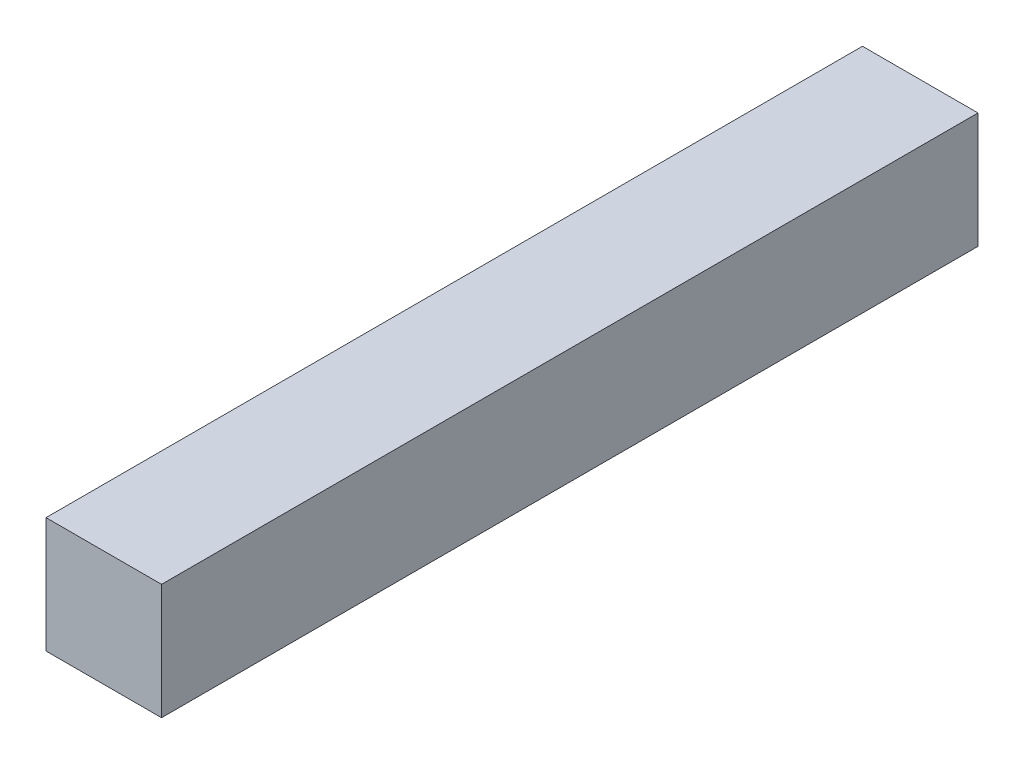
ISO-10303-21;
HEADER;
FILE_DESCRIPTION(('STEP AP214'),'2;1');
FILE_NAME('part.step','',(''),(''),'','','');
FILE_SCHEMA(('AUTOMOTIVE_DESIGN { 1 0 10303 214 1 1 1 1 }'));
ENDSEC;
DATA;
#1=APPLICATION_CONTEXT('core data for automotive mechanical design processes');
#2=APPLICATION_PROTOCOL_DEFINITION('international standard','automotive_design',2000,#1);
#3=PRODUCT_CONTEXT('',#1,'mechanical');
#4=PRODUCT('Part','Part','',(#3));
#5=PRODUCT_RELATED_PRODUCT_CATEGORY('part','',(#4));
#6=PRODUCT_DEFINITION_FORMATION('','',#4);
#7=PRODUCT_DEFINITION_CONTEXT('part definition',#1,'design');
#8=PRODUCT_DEFINITION('design','',#6,#7);
#9=PRODUCT_DEFINITION_SHAPE('','',#8);
#10=(LENGTH_UNIT() NAMED_UNIT(*) SI_UNIT(.MILLI.,.METRE.));
#11=(NAMED_UNIT(*) PLANE_ANGLE_UNIT() SI_UNIT($,.RADIAN.));
#12=(NAMED_UNIT(*) SI_UNIT($,.STERADIAN.) SOLID_ANGLE_UNIT());
#13=UNCERTAINTY_MEASURE_WITH_UNIT(LENGTH_MEASURE(1.E-05),#10,'distance_accuracy_value','');
#14=(GEOMETRIC_REPRESENTATION_CONTEXT(3) GLOBAL_UNCERTAINTY_ASSIGNED_CONTEXT((#13)) GLOBAL_UNIT_ASSIGNED_CONTEXT((#10,
#11,#12)) REPRESENTATION_CONTEXT('',''));
#15=CARTESIAN_POINT('',(0.,0.,0.));
#16=DIRECTION('',(0.,0.,1.));
#17=DIRECTION('',(1.,0.,0.));
#18=AXIS2_PLACEMENT_3D('',#15,#16,#17);
#19=CARTESIAN_POINT('',(-2.38125,2.38125,33.655));
#20=DIRECTION('',(1.,0.,0.));
#21=DIRECTION('',(0.,1.,0.));
#22=AXIS2_PLACEMENT_3D('',#19,#20,#21);
#23=PLANE('',#22);
#24=DIRECTION('',(0.,-1.,0.));
#25=VECTOR('',#24,1.);
#26=CARTESIAN_POINT('',(-2.38125,2.38125,0.));
#27=LINE('',#26,#25);
#28=CARTESIAN_POINT('',(-2.38125,2.38125,0.));
#29=VERTEX_POINT('',#28);
#30=CARTESIAN_POINT('',(-2.38125,-2.38125,0.));
#31=VERTEX_POINT('',#30);
#32=EDGE_CURVE('E98',#29,#31,#27,.T.);
#33=ORIENTED_EDGE('',*,*,#32,.T.);
#34=DIRECTION('',(0.,0.,-1.));
#35=VECTOR('',#34,1.);
#36=CARTESIAN_POINT('',(-2.38125,-2.38125,33.655));
#37=LINE('',#36,#35);
#38=CARTESIAN_POINT('',(-2.38125,-2.38125,33.655));
#39=VERTEX_POINT('',#38);
#40=EDGE_CURVE('E11',#39,#31,#37,.T.);
#41=ORIENTED_EDGE('',*,*,#40,.F.);
#42=DIRECTION('',(0.,-1.,0.));
#43=VECTOR('',#42,1.);
#44=CARTESIAN_POINT('',(-2.38125,2.38125,33.655));
#45=LINE('',#44,#43);
#46=CARTESIAN_POINT('',(-2.38125,2.38125,33.655));
#47=VERTEX_POINT('',#46);
#48=EDGE_CURVE('E86',#47,#39,#45,.T.);
#49=ORIENTED_EDGE('',*,*,#48,.F.);
#50=DIRECTION('',(0.,0.,-1.));
#51=VECTOR('',#50,1.);
#52=CARTESIAN_POINT('',(-2.38125,2.38125,33.655));
#53=LINE('',#52,#51);
#54=EDGE_CURVE('E94',#47,#29,#53,.T.);
#55=ORIENTED_EDGE('',*,*,#54,.T.);
#56=EDGE_LOOP('',(#33,#41,#49,#55));
#57=FACE_BOUND('',#56,.T.);
#58=ADVANCED_FACE('F35',(#57),#23,.F.);
#59=CARTESIAN_POINT('',(-2.38125,-2.38125,33.655));
#60=DIRECTION('',(0.,1.,0.));
#61=DIRECTION('',(0.,0.,1.));
#62=AXIS2_PLACEMENT_3D('',#59,#60,#61);
#63=PLANE('',#62);
#64=DIRECTION('',(1.,0.,0.));
#65=VECTOR('',#64,1.);
#66=CARTESIAN_POINT('',(-2.38125,-2.38125,0.));
#67=LINE('',#66,#65);
#68=CARTESIAN_POINT('',(2.38125,-2.38125,0.));
#69=VERTEX_POINT('',#68);
#70=EDGE_CURVE('E90',#31,#69,#67,.T.);
#71=ORIENTED_EDGE('',*,*,#70,.T.);
#72=DIRECTION('',(0.,0.,-1.));
#73=VECTOR('',#72,1.);
#74=CARTESIAN_POINT('',(2.38125,-2.38125,33.655));
#75=LINE('',#74,#73);
#76=CARTESIAN_POINT('',(2.38125,-2.38125,33.655));
#77=VERTEX_POINT('',#76);
#78=EDGE_CURVE('E43',#77,#69,#75,.T.);
#79=ORIENTED_EDGE('',*,*,#78,.F.);
#80=DIRECTION('',(1.,0.,0.));
#81=VECTOR('',#80,1.);
#82=CARTESIAN_POINT('',(-2.38125,-2.38125,33.655));
#83=LINE('',#82,#81);
#84=EDGE_CURVE('E81',#39,#77,#83,.T.);
#85=ORIENTED_EDGE('',*,*,#84,.F.);
#86=ORIENTED_EDGE('',*,*,#40,.T.);
#87=EDGE_LOOP('',(#71,#79,#85,#86));
#88=FACE_BOUND('',#87,.T.);
#89=ADVANCED_FACE('F89',(#88),#63,.F.);
#90=CARTESIAN_POINT('',(2.38125,2.38125,33.655));
#91=DIRECTION('',(-1.,0.,0.));
#92=DIRECTION('',(0.,-1.,0.));
#93=AXIS2_PLACEMENT_3D('',#90,#91,#92);
#94=PLANE('',#93);
#95=DIRECTION('',(0.,1.,0.));
#96=VECTOR('',#95,1.);
#97=CARTESIAN_POINT('',(2.38125,2.38125,0.));
#98=LINE('',#97,#96);
#99=CARTESIAN_POINT('',(2.38125,2.38125,0.));
#100=VERTEX_POINT('',#99);
#101=EDGE_CURVE('E68',#69,#100,#98,.T.);
#102=ORIENTED_EDGE('',*,*,#101,.T.);
#103=DIRECTION('',(0.,0.,-1.));
#104=VECTOR('',#103,1.);
#105=CARTESIAN_POINT('',(2.38125,2.38125,33.655));
#106=LINE('',#105,#104);
#107=CARTESIAN_POINT('',(2.38125,2.38125,33.655));
#108=VERTEX_POINT('',#107);
#109=EDGE_CURVE('E91',#108,#100,#106,.T.);
#110=ORIENTED_EDGE('',*,*,#109,.F.);
#111=DIRECTION('',(0.,1.,0.));
#112=VECTOR('',#111,1.);
#113=CARTESIAN_POINT('',(2.38125,2.38125,33.655));
#114=LINE('',#113,#112);
#115=EDGE_CURVE('E84',#77,#108,#114,.T.);
#116=ORIENTED_EDGE('',*,*,#115,.F.);
#117=ORIENTED_EDGE('',*,*,#78,.T.);
#118=EDGE_LOOP('',(#102,#110,#116,#117));
#119=FACE_BOUND('',#118,.T.);
#120=ADVANCED_FACE('F92',(#119),#94,.F.);
#121=CARTESIAN_POINT('',(-2.38125,2.38125,33.655));
#122=DIRECTION('',(0.,-1.,0.));
#123=DIRECTION('',(1.,0.,0.));
#124=AXIS2_PLACEMENT_3D('',#121,#122,#123);
#125=PLANE('',#124);
#126=DIRECTION('',(-1.,0.,0.));
#127=VECTOR('',#126,1.);
#128=CARTESIAN_POINT('',(-2.38125,2.38125,0.));
#129=LINE('',#128,#127);
#130=EDGE_CURVE('E74',#100,#29,#129,.T.);
#131=ORIENTED_EDGE('',*,*,#130,.T.);
#132=ORIENTED_EDGE('',*,*,#54,.F.);
#133=DIRECTION('',(-1.,0.,0.));
#134=VECTOR('',#133,1.);
#135=CARTESIAN_POINT('',(-2.38125,2.38125,33.655));
#136=LINE('',#135,#134);
#137=EDGE_CURVE('E51',#108,#47,#136,.T.);
#138=ORIENTED_EDGE('',*,*,#137,.F.);
#139=ORIENTED_EDGE('',*,*,#109,.T.);
#140=EDGE_LOOP('',(#131,#132,#138,#139));
#141=FACE_BOUND('',#140,.T.);
#142=ADVANCED_FACE('F105',(#141),#125,.F.);
#143=CARTESIAN_POINT('',(-2.38125,-2.38125,33.655));
#144=DIRECTION('',(0.,0.,1.));
#145=DIRECTION('',(1.,0.,0.));
#146=AXIS2_PLACEMENT_3D('',#143,#144,#145);
#147=PLANE('',#146);
#148=ORIENTED_EDGE('',*,*,#48,.T.);
#149=ORIENTED_EDGE('',*,*,#84,.T.);
#150=ORIENTED_EDGE('',*,*,#115,.T.);
#151=ORIENTED_EDGE('',*,*,#137,.T.);
#152=EDGE_LOOP('',(#148,#149,#150,#151));
#153=FACE_BOUND('',#152,.T.);
#154=ADVANCED_FACE('F82',(#153),#147,.T.);
#155=CARTESIAN_POINT('',(-2.38125,-2.38125,0.));
#156=DIRECTION('',(0.,0.,1.));
#157=DIRECTION('',(1.,0.,0.));
#158=AXIS2_PLACEMENT_3D('',#155,#156,#157);
#159=PLANE('',#158);
#160=ORIENTED_EDGE('',*,*,#32,.F.);
#161=ORIENTED_EDGE('',*,*,#130,.F.);
#162=ORIENTED_EDGE('',*,*,#101,.F.);
#163=ORIENTED_EDGE('',*,*,#70,.F.);
#164=EDGE_LOOP('',(#160,#161,#162,#163));
#165=FACE_BOUND('',#164,.T.);
#166=ADVANCED_FACE('F108',(#165),#159,.F.);
#167=CLOSED_SHELL('',(#58,#89,#120,#142,#154,#166));
#168=MANIFOLD_SOLID_BREP('B2',#167);
#169=ADVANCED_BREP_SHAPE_REPRESENTATION('',(#18,#168),#14);
#170=SHAPE_DEFINITION_REPRESENTATION(#9,#169);
ENDSEC;
END-ISO-10303-21;
